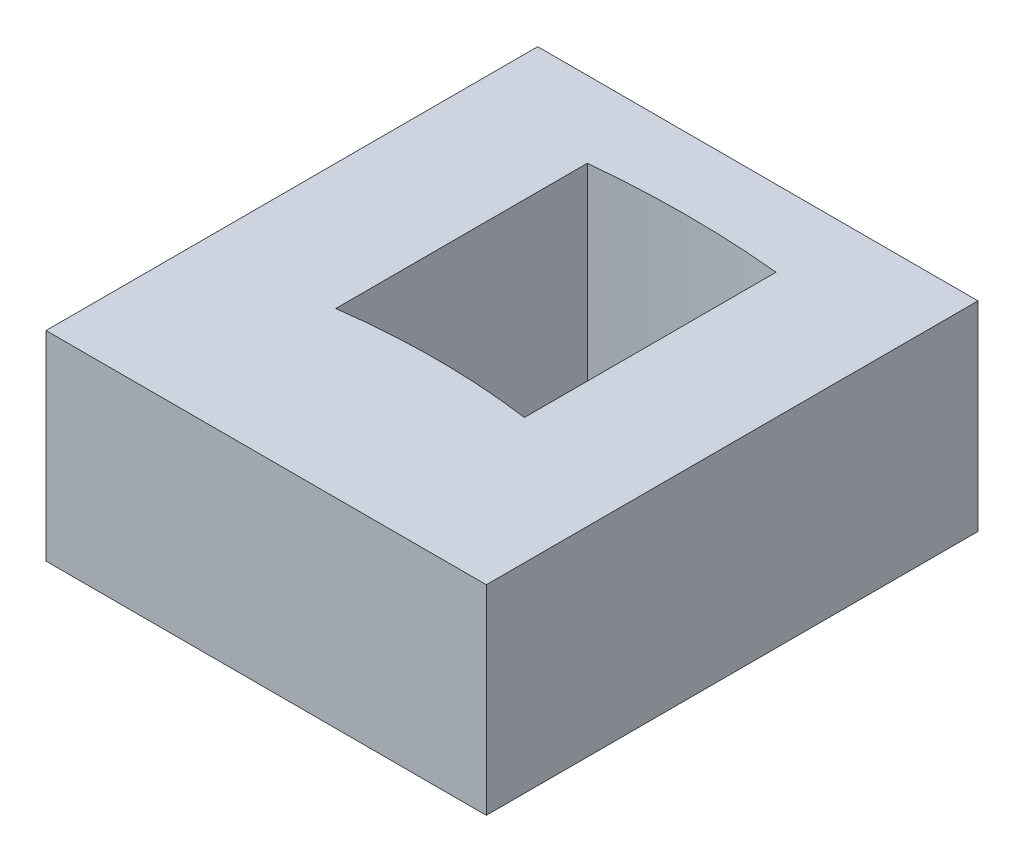
ISO-10303-21;
HEADER;
FILE_DESCRIPTION(('STEP AP214'),'2;1');
FILE_NAME('part.step','',(''),(''),'','','');
FILE_SCHEMA(('AUTOMOTIVE_DESIGN { 1 0 10303 214 1 1 1 1 }'));
ENDSEC;
DATA;
#1=APPLICATION_CONTEXT('core data for automotive mechanical design processes');
#2=APPLICATION_PROTOCOL_DEFINITION('international standard','automotive_design',2000,#1);
#3=PRODUCT_CONTEXT('',#1,'mechanical');
#4=PRODUCT('Part','Part','',(#3));
#5=PRODUCT_RELATED_PRODUCT_CATEGORY('part','',(#4));
#6=PRODUCT_DEFINITION_FORMATION('','',#4);
#7=PRODUCT_DEFINITION_CONTEXT('part definition',#1,'design');
#8=PRODUCT_DEFINITION('design','',#6,#7);
#9=PRODUCT_DEFINITION_SHAPE('','',#8);
#10=(LENGTH_UNIT() NAMED_UNIT(*) SI_UNIT(.MILLI.,.METRE.));
#11=(NAMED_UNIT(*) PLANE_ANGLE_UNIT() SI_UNIT($,.RADIAN.));
#12=(NAMED_UNIT(*) SI_UNIT($,.STERADIAN.) SOLID_ANGLE_UNIT());
#13=UNCERTAINTY_MEASURE_WITH_UNIT(LENGTH_MEASURE(1.E-05),#10,'distance_accuracy_value','');
#14=(GEOMETRIC_REPRESENTATION_CONTEXT(3) GLOBAL_UNCERTAINTY_ASSIGNED_CONTEXT((#13)) GLOBAL_UNIT_ASSIGNED_CONTEXT((#10,
#11,#12)) REPRESENTATION_CONTEXT('',''));
#15=CARTESIAN_POINT('',(0.,0.,0.));
#16=DIRECTION('',(0.,0.,1.));
#17=DIRECTION('',(1.,0.,0.));
#18=AXIS2_PLACEMENT_3D('',#15,#16,#17);
#19=CARTESIAN_POINT('',(-1.6,3.175,0.));
#20=DIRECTION('',(1.,0.,0.));
#21=DIRECTION('',(0.,0.,-1.));
#22=AXIS2_PLACEMENT_3D('',#19,#20,#21);
#23=PLANE('',#22);
#24=DIRECTION('',(0.,0.,1.));
#25=VECTOR('',#24,1.);
#26=CARTESIAN_POINT('',(-1.6,0.,0.));
#27=LINE('',#26,#25);
#28=CARTESIAN_POINT('',(-1.6,0.,-4.));
#29=VERTEX_POINT('',#28);
#30=CARTESIAN_POINT('',(-1.6,0.,0.));
#31=VERTEX_POINT('',#30);
#32=EDGE_CURVE('E150',#29,#31,#27,.T.);
#33=ORIENTED_EDGE('',*,*,#32,.F.);
#34=DIRECTION('',(0.,-1.,0.));
#35=VECTOR('',#34,1.);
#36=CARTESIAN_POINT('',(-1.6,3.175,-4.));
#37=LINE('',#36,#35);
#38=CARTESIAN_POINT('',(-1.6,3.175,-4.));
#39=VERTEX_POINT('',#38);
#40=EDGE_CURVE('E11',#39,#29,#37,.T.);
#41=ORIENTED_EDGE('',*,*,#40,.F.);
#42=DIRECTION('',(0.,0.,1.));
#43=VECTOR('',#42,1.);
#44=CARTESIAN_POINT('',(-1.6,3.175,0.));
#45=LINE('',#44,#43);
#46=CARTESIAN_POINT('',(-1.6,3.175,0.));
#47=VERTEX_POINT('',#46);
#48=EDGE_CURVE('E120',#39,#47,#45,.T.);
#49=ORIENTED_EDGE('',*,*,#48,.T.);
#50=DIRECTION('',(0.,-1.,0.));
#51=VECTOR('',#50,1.);
#52=CARTESIAN_POINT('',(-1.6,3.175,0.));
#53=LINE('',#52,#51);
#54=EDGE_CURVE('E54',#47,#31,#53,.T.);
#55=ORIENTED_EDGE('',*,*,#54,.T.);
#56=EDGE_LOOP('',(#33,#41,#49,#55));
#57=FACE_BOUND('',#56,.T.);
#58=ADVANCED_FACE('F35',(#57),#23,.T.);
#59=CARTESIAN_POINT('',(-0.0999999999999991,3.175,10.9248115566376));
#60=DIRECTION('',(0.,-1.,0.));
#61=DIRECTION('',(0.,0.,-1.));
#62=AXIS2_PLACEMENT_3D('',#59,#60,#61);
#63=CYLINDRICAL_SURFACE('',#62,15.0000000000381);
#64=CARTESIAN_POINT('',(-0.0999999999999991,0.,10.9248115566376));
#65=DIRECTION('',(0.,1.,0.));
#66=DIRECTION('',(0.,0.,1.));
#67=AXIS2_PLACEMENT_3D('',#64,#65,#66);
#68=CIRCLE('',#67,15.0000000000381);
#69=CARTESIAN_POINT('',(1.4,0.,-4.));
#70=VERTEX_POINT('',#69);
#71=EDGE_CURVE('E125',#29,#70,#68,.F.);
#72=ORIENTED_EDGE('',*,*,#71,.T.);
#73=DIRECTION('',(0.,-1.,0.));
#74=VECTOR('',#73,1.);
#75=CARTESIAN_POINT('',(1.4,3.175,-4.));
#76=LINE('',#75,#74);
#77=CARTESIAN_POINT('',(1.4,3.175,-4.));
#78=VERTEX_POINT('',#77);
#79=EDGE_CURVE('E45',#78,#70,#76,.T.);
#80=ORIENTED_EDGE('',*,*,#79,.F.);
#81=CARTESIAN_POINT('',(-0.0999999999999991,3.175,10.9248115566376));
#82=DIRECTION('',(0.,1.,0.));
#83=DIRECTION('',(0.,0.,1.));
#84=AXIS2_PLACEMENT_3D('',#81,#82,#83);
#85=CIRCLE('',#84,15.0000000000381);
#86=EDGE_CURVE('E115',#39,#78,#85,.F.);
#87=ORIENTED_EDGE('',*,*,#86,.F.);
#88=ORIENTED_EDGE('',*,*,#40,.T.);
#89=EDGE_LOOP('',(#72,#80,#87,#88));
#90=FACE_BOUND('',#89,.T.);
#91=ADVANCED_FACE('F123',(#90),#63,.F.);
#92=CARTESIAN_POINT('',(1.4,3.175,0.));
#93=DIRECTION('',(1.,0.,0.));
#94=DIRECTION('',(0.,0.,-1.));
#95=AXIS2_PLACEMENT_3D('',#92,#93,#94);
#96=PLANE('',#95);
#97=DIRECTION('',(0.,0.,1.));
#98=VECTOR('',#97,1.);
#99=CARTESIAN_POINT('',(1.4,0.,0.));
#100=LINE('',#99,#98);
#101=CARTESIAN_POINT('',(1.4,0.,0.));
#102=VERTEX_POINT('',#101);
#103=EDGE_CURVE('E147',#70,#102,#100,.T.);
#104=ORIENTED_EDGE('',*,*,#103,.T.);
#105=DIRECTION('',(0.,-1.,0.));
#106=VECTOR('',#105,1.);
#107=CARTESIAN_POINT('',(1.4,3.175,0.));
#108=LINE('',#107,#106);
#109=CARTESIAN_POINT('',(1.4,3.175,0.));
#110=VERTEX_POINT('',#109);
#111=EDGE_CURVE('E80',#110,#102,#108,.T.);
#112=ORIENTED_EDGE('',*,*,#111,.F.);
#113=DIRECTION('',(0.,0.,1.));
#114=VECTOR('',#113,1.);
#115=CARTESIAN_POINT('',(1.4,3.175,0.));
#116=LINE('',#115,#114);
#117=EDGE_CURVE('E107',#78,#110,#116,.T.);
#118=ORIENTED_EDGE('',*,*,#117,.F.);
#119=ORIENTED_EDGE('',*,*,#79,.T.);
#120=EDGE_LOOP('',(#104,#112,#118,#119));
#121=FACE_BOUND('',#120,.T.);
#122=ADVANCED_FACE('F109',(#121),#96,.F.);
#123=CARTESIAN_POINT('',(0.,3.175,-5.21099320301547));
#124=DIRECTION('',(0.,0.,-1.));
#125=DIRECTION('',(-1.,0.,0.));
#126=AXIS2_PLACEMENT_3D('',#123,#124,#125);
#127=PLANE('',#126);
#128=DIRECTION('',(1.,0.,0.));
#129=VECTOR('',#128,1.);
#130=CARTESIAN_POINT('',(0.,0.,-5.21099320301547));
#131=LINE('',#130,#129);
#132=CARTESIAN_POINT('',(-3.6,0.,-5.21099320301547));
#133=VERTEX_POINT('',#132);
#134=CARTESIAN_POINT('',(3.4,0.,-5.21099320301547));
#135=VERTEX_POINT('',#134);
#136=EDGE_CURVE('E159',#133,#135,#131,.T.);
#137=ORIENTED_EDGE('',*,*,#136,.F.);
#138=DIRECTION('',(0.,-1.,0.));
#139=VECTOR('',#138,1.);
#140=CARTESIAN_POINT('',(-3.6,3.175,-5.21099320301547));
#141=LINE('',#140,#139);
#142=CARTESIAN_POINT('',(-3.6,3.175,-5.21099320301547));
#143=VERTEX_POINT('',#142);
#144=EDGE_CURVE('E39',#143,#133,#141,.T.);
#145=ORIENTED_EDGE('',*,*,#144,.F.);
#146=DIRECTION('',(1.,0.,0.));
#147=VECTOR('',#146,1.);
#148=CARTESIAN_POINT('',(0.,3.175,-5.21099320301547));
#149=LINE('',#148,#147);
#150=CARTESIAN_POINT('',(3.4,3.175,-5.21099320301547));
#151=VERTEX_POINT('',#150);
#152=EDGE_CURVE('E146',#143,#151,#149,.T.);
#153=ORIENTED_EDGE('',*,*,#152,.T.);
#154=DIRECTION('',(0.,-1.,0.));
#155=VECTOR('',#154,1.);
#156=CARTESIAN_POINT('',(3.4,3.175,-5.21099320301547));
#157=LINE('',#156,#155);
#158=EDGE_CURVE('E130',#151,#135,#157,.T.);
#159=ORIENTED_EDGE('',*,*,#158,.T.);
#160=EDGE_LOOP('',(#137,#145,#153,#159));
#161=FACE_BOUND('',#160,.T.);
#162=ADVANCED_FACE('F37',(#161),#127,.T.);
#163=CARTESIAN_POINT('',(-3.6,3.175,0.));
#164=DIRECTION('',(1.,0.,0.));
#165=DIRECTION('',(0.,0.,-1.));
#166=AXIS2_PLACEMENT_3D('',#163,#164,#165);
#167=PLANE('',#166);
#168=DIRECTION('',(0.,0.,1.));
#169=VECTOR('',#168,1.);
#170=CARTESIAN_POINT('',(-3.6,0.,0.));
#171=LINE('',#170,#169);
#172=CARTESIAN_POINT('',(-3.6,0.,2.60568538294921));
#173=VERTEX_POINT('',#172);
#174=EDGE_CURVE('E157',#133,#173,#171,.T.);
#175=ORIENTED_EDGE('',*,*,#174,.T.);
#176=DIRECTION('',(0.,-1.,0.));
#177=VECTOR('',#176,1.);
#178=CARTESIAN_POINT('',(-3.6,3.175,2.60568538294921));
#179=LINE('',#178,#177);
#180=CARTESIAN_POINT('',(-3.6,3.175,2.60568538294921));
#181=VERTEX_POINT('',#180);
#182=EDGE_CURVE('E133',#181,#173,#179,.T.);
#183=ORIENTED_EDGE('',*,*,#182,.F.);
#184=DIRECTION('',(0.,0.,1.));
#185=VECTOR('',#184,1.);
#186=CARTESIAN_POINT('',(-3.6,3.175,0.));
#187=LINE('',#186,#185);
#188=EDGE_CURVE('E169',#143,#181,#187,.T.);
#189=ORIENTED_EDGE('',*,*,#188,.F.);
#190=ORIENTED_EDGE('',*,*,#144,.T.);
#191=EDGE_LOOP('',(#175,#183,#189,#190));
#192=FACE_BOUND('',#191,.T.);
#193=ADVANCED_FACE('F181',(#192),#167,.F.);
#194=CARTESIAN_POINT('',(0.,3.175,2.60568538294921));
#195=DIRECTION('',(0.,0.,-1.));
#196=DIRECTION('',(-1.,0.,0.));
#197=AXIS2_PLACEMENT_3D('',#194,#195,#196);
#198=PLANE('',#197);
#199=DIRECTION('',(1.,0.,0.));
#200=VECTOR('',#199,1.);
#201=CARTESIAN_POINT('',(0.,0.,2.60568538294921));
#202=LINE('',#201,#200);
#203=CARTESIAN_POINT('',(3.4,0.,2.60568538294921));
#204=VERTEX_POINT('',#203);
#205=EDGE_CURVE('E155',#173,#204,#202,.T.);
#206=ORIENTED_EDGE('',*,*,#205,.T.);
#207=DIRECTION('',(0.,-1.,0.));
#208=VECTOR('',#207,1.);
#209=CARTESIAN_POINT('',(3.4,3.175,2.60568538294921));
#210=LINE('',#209,#208);
#211=CARTESIAN_POINT('',(3.4,3.175,2.60568538294921));
#212=VERTEX_POINT('',#211);
#213=EDGE_CURVE('E132',#212,#204,#210,.T.);
#214=ORIENTED_EDGE('',*,*,#213,.F.);
#215=DIRECTION('',(1.,0.,0.));
#216=VECTOR('',#215,1.);
#217=CARTESIAN_POINT('',(0.,3.175,2.60568538294921));
#218=LINE('',#217,#216);
#219=EDGE_CURVE('E167',#181,#212,#218,.T.);
#220=ORIENTED_EDGE('',*,*,#219,.F.);
#221=ORIENTED_EDGE('',*,*,#182,.T.);
#222=EDGE_LOOP('',(#206,#214,#220,#221));
#223=FACE_BOUND('',#222,.T.);
#224=ADVANCED_FACE('F182',(#223),#198,.F.);
#225=CARTESIAN_POINT('',(3.4,3.175,0.));
#226=DIRECTION('',(1.,0.,0.));
#227=DIRECTION('',(0.,0.,-1.));
#228=AXIS2_PLACEMENT_3D('',#225,#226,#227);
#229=PLANE('',#228);
#230=DIRECTION('',(0.,0.,1.));
#231=VECTOR('',#230,1.);
#232=CARTESIAN_POINT('',(3.4,0.,0.));
#233=LINE('',#232,#231);
#234=EDGE_CURVE('E152',#135,#204,#233,.T.);
#235=ORIENTED_EDGE('',*,*,#234,.F.);
#236=ORIENTED_EDGE('',*,*,#158,.F.);
#237=DIRECTION('',(0.,0.,1.));
#238=VECTOR('',#237,1.);
#239=CARTESIAN_POINT('',(3.4,3.175,0.));
#240=LINE('',#239,#238);
#241=EDGE_CURVE('E164',#151,#212,#240,.T.);
#242=ORIENTED_EDGE('',*,*,#241,.T.);
#243=ORIENTED_EDGE('',*,*,#213,.T.);
#244=EDGE_LOOP('',(#235,#236,#242,#243));
#245=FACE_BOUND('',#244,.T.);
#246=ADVANCED_FACE('F177',(#245),#229,.T.);
#247=CARTESIAN_POINT('',(-0.0999999999999978,3.175,10.8972473590372));
#248=DIRECTION('',(0.,-1.,0.));
#249=DIRECTION('',(0.,0.,-1.));
#250=AXIS2_PLACEMENT_3D('',#247,#248,#249);
#251=CYLINDRICAL_SURFACE('',#250,11.0000000001838);
#252=CARTESIAN_POINT('',(-0.0999999999999978,0.,10.8972473590372));
#253=DIRECTION('',(0.,1.,0.));
#254=DIRECTION('',(0.,0.,1.));
#255=AXIS2_PLACEMENT_3D('',#252,#253,#254);
#256=CIRCLE('',#255,11.0000000001838);
#257=EDGE_CURVE('E143',#31,#102,#256,.F.);
#258=ORIENTED_EDGE('',*,*,#257,.F.);
#259=ORIENTED_EDGE('',*,*,#54,.F.);
#260=CARTESIAN_POINT('',(-0.0999999999999978,3.175,10.8972473590372));
#261=DIRECTION('',(0.,1.,0.));
#262=DIRECTION('',(0.,0.,1.));
#263=AXIS2_PLACEMENT_3D('',#260,#261,#262);
#264=CIRCLE('',#263,11.0000000001838);
#265=EDGE_CURVE('E114',#47,#110,#264,.F.);
#266=ORIENTED_EDGE('',*,*,#265,.T.);
#267=ORIENTED_EDGE('',*,*,#111,.T.);
#268=EDGE_LOOP('',(#258,#259,#266,#267));
#269=FACE_BOUND('',#268,.T.);
#270=ADVANCED_FACE('F189',(#269),#251,.T.);
#271=CARTESIAN_POINT('',(0.,3.175,0.));
#272=DIRECTION('',(0.,1.,0.));
#273=DIRECTION('',(0.,0.,1.));
#274=AXIS2_PLACEMENT_3D('',#271,#272,#273);
#275=PLANE('',#274);
#276=ORIENTED_EDGE('',*,*,#152,.F.);
#277=ORIENTED_EDGE('',*,*,#188,.T.);
#278=ORIENTED_EDGE('',*,*,#219,.T.);
#279=ORIENTED_EDGE('',*,*,#241,.F.);
#280=EDGE_LOOP('',(#276,#277,#278,#279));
#281=FACE_BOUND('',#280,.T.);
#282=ORIENTED_EDGE('',*,*,#48,.F.);
#283=ORIENTED_EDGE('',*,*,#86,.T.);
#284=ORIENTED_EDGE('',*,*,#117,.T.);
#285=ORIENTED_EDGE('',*,*,#265,.F.);
#286=EDGE_LOOP('',(#282,#283,#284,#285));
#287=FACE_BOUND('',#286,.T.);
#288=ADVANCED_FACE('F119',(#281,#287),#275,.T.);
#289=CARTESIAN_POINT('',(0.,0.,0.));
#290=DIRECTION('',(0.,1.,0.));
#291=DIRECTION('',(0.,0.,1.));
#292=AXIS2_PLACEMENT_3D('',#289,#290,#291);
#293=PLANE('',#292);
#294=ORIENTED_EDGE('',*,*,#136,.T.);
#295=ORIENTED_EDGE('',*,*,#234,.T.);
#296=ORIENTED_EDGE('',*,*,#205,.F.);
#297=ORIENTED_EDGE('',*,*,#174,.F.);
#298=EDGE_LOOP('',(#294,#295,#296,#297));
#299=FACE_BOUND('',#298,.T.);
#300=ORIENTED_EDGE('',*,*,#32,.T.);
#301=ORIENTED_EDGE('',*,*,#257,.T.);
#302=ORIENTED_EDGE('',*,*,#103,.F.);
#303=ORIENTED_EDGE('',*,*,#71,.F.);
#304=EDGE_LOOP('',(#300,#301,#302,#303));
#305=FACE_BOUND('',#304,.T.);
#306=ADVANCED_FACE('F179',(#299,#305),#293,.F.);
#307=CLOSED_SHELL('',(#58,#91,#122,#162,#193,#224,#246,#270,#288,#306));
#308=MANIFOLD_SOLID_BREP('B2',#307);
#309=ADVANCED_BREP_SHAPE_REPRESENTATION('',(#18,#308),#14);
#310=SHAPE_DEFINITION_REPRESENTATION(#9,#309);
ENDSEC;
END-ISO-10303-21;
